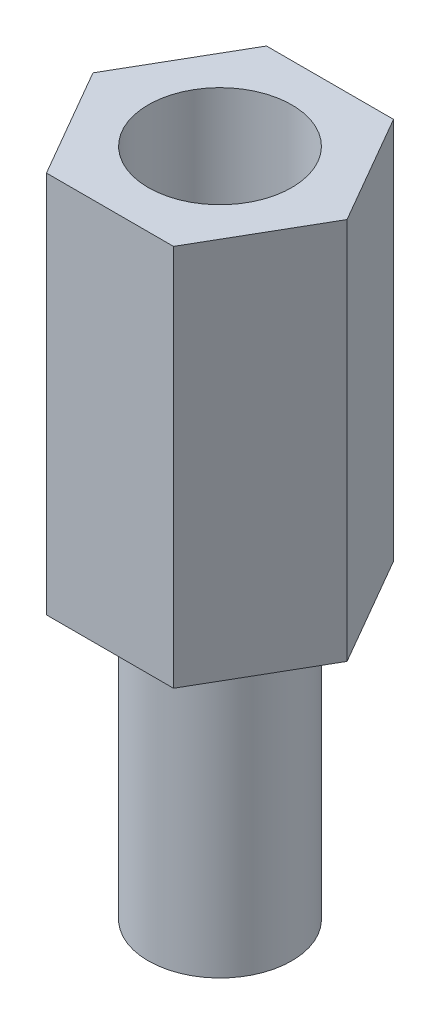
ISO-10303-21;
HEADER;
FILE_DESCRIPTION(('STEP AP214'),'2;1');
FILE_NAME('part.step','',(''),(''),'','','');
FILE_SCHEMA(('AUTOMOTIVE_DESIGN { 1 0 10303 214 1 1 1 1 }'));
ENDSEC;
DATA;
#1=APPLICATION_CONTEXT('core data for automotive mechanical design processes');
#2=APPLICATION_PROTOCOL_DEFINITION('international standard','automotive_design',2000,#1);
#3=PRODUCT_CONTEXT('',#1,'mechanical');
#4=PRODUCT('Part','Part','',(#3));
#5=PRODUCT_RELATED_PRODUCT_CATEGORY('part','',(#4));
#6=PRODUCT_DEFINITION_FORMATION('','',#4);
#7=PRODUCT_DEFINITION_CONTEXT('part definition',#1,'design');
#8=PRODUCT_DEFINITION('design','',#6,#7);
#9=PRODUCT_DEFINITION_SHAPE('','',#8);
#10=(LENGTH_UNIT() NAMED_UNIT(*) SI_UNIT(.MILLI.,.METRE.));
#11=(NAMED_UNIT(*) PLANE_ANGLE_UNIT() SI_UNIT($,.RADIAN.));
#12=(NAMED_UNIT(*) SI_UNIT($,.STERADIAN.) SOLID_ANGLE_UNIT());
#13=UNCERTAINTY_MEASURE_WITH_UNIT(LENGTH_MEASURE(1.E-05),#10,'distance_accuracy_value','');
#14=(GEOMETRIC_REPRESENTATION_CONTEXT(3) GLOBAL_UNCERTAINTY_ASSIGNED_CONTEXT((#13)) GLOBAL_UNIT_ASSIGNED_CONTEXT((#10,
#11,#12)) REPRESENTATION_CONTEXT('',''));
#15=CARTESIAN_POINT('',(0.,0.,0.));
#16=DIRECTION('',(0.,0.,1.));
#17=DIRECTION('',(1.,0.,0.));
#18=AXIS2_PLACEMENT_3D('',#15,#16,#17);
#19=CARTESIAN_POINT('',(1.32790561913616,8.,2.29999999999999));
#20=DIRECTION('',(-0.866025403784444,0.,-0.499999999999992));
#21=DIRECTION('',(-0.499999999999992,0.,0.866025403784444));
#22=AXIS2_PLACEMENT_3D('',#19,#20,#21);
#23=PLANE('',#22);
#24=DIRECTION('',(0.499999999999992,0.,-0.866025403784444));
#25=VECTOR('',#24,1.);
#26=CARTESIAN_POINT('',(1.32790561913616,0.,2.29999999999999));
#27=LINE('',#26,#25);
#28=CARTESIAN_POINT('',(1.32790561913616,0.,2.29999999999999));
#29=VERTEX_POINT('',#28);
#30=CARTESIAN_POINT('',(2.65581123827228,0.,0.));
#31=VERTEX_POINT('',#30);
#32=EDGE_CURVE('E128',#29,#31,#27,.T.);
#33=ORIENTED_EDGE('',*,*,#32,.T.);
#34=DIRECTION('',(0.,-1.,0.));
#35=VECTOR('',#34,1.);
#36=CARTESIAN_POINT('',(2.65581123827228,8.,0.));
#37=LINE('',#36,#35);
#38=CARTESIAN_POINT('',(2.65581123827228,8.,0.));
#39=VERTEX_POINT('',#38);
#40=EDGE_CURVE('E11',#39,#31,#37,.T.);
#41=ORIENTED_EDGE('',*,*,#40,.F.);
#42=DIRECTION('',(0.499999999999992,0.,-0.866025403784444));
#43=VECTOR('',#42,1.);
#44=CARTESIAN_POINT('',(1.32790561913616,8.,2.29999999999999));
#45=LINE('',#44,#43);
#46=CARTESIAN_POINT('',(1.32790561913616,8.,2.29999999999999));
#47=VERTEX_POINT('',#46);
#48=EDGE_CURVE('E145',#47,#39,#45,.T.);
#49=ORIENTED_EDGE('',*,*,#48,.F.);
#50=DIRECTION('',(0.,-1.,0.));
#51=VECTOR('',#50,1.);
#52=CARTESIAN_POINT('',(1.32790561913616,8.,2.29999999999999));
#53=LINE('',#52,#51);
#54=EDGE_CURVE('E124',#47,#29,#53,.T.);
#55=ORIENTED_EDGE('',*,*,#54,.T.);
#56=EDGE_LOOP('',(#33,#41,#49,#55));
#57=FACE_BOUND('',#56,.T.);
#58=ADVANCED_FACE('F39',(#57),#23,.F.);
#59=CARTESIAN_POINT('',(2.65581123827228,8.,0.));
#60=DIRECTION('',(-0.866025403784434,0.,0.500000000000008));
#61=DIRECTION('',(0.500000000000008,0.,0.866025403784434));
#62=AXIS2_PLACEMENT_3D('',#59,#60,#61);
#63=PLANE('',#62);
#64=DIRECTION('',(-0.500000000000008,0.,-0.866025403784434));
#65=VECTOR('',#64,1.);
#66=CARTESIAN_POINT('',(2.65581123827228,0.,0.));
#67=LINE('',#66,#65);
#68=CARTESIAN_POINT('',(1.32790561913612,0.,-2.30000000000001));
#69=VERTEX_POINT('',#68);
#70=EDGE_CURVE('E132',#31,#69,#67,.T.);
#71=ORIENTED_EDGE('',*,*,#70,.T.);
#72=DIRECTION('',(0.,-1.,0.));
#73=VECTOR('',#72,1.);
#74=CARTESIAN_POINT('',(1.32790561913612,8.,-2.30000000000001));
#75=LINE('',#74,#73);
#76=CARTESIAN_POINT('',(1.32790561913612,8.,-2.30000000000001));
#77=VERTEX_POINT('',#76);
#78=EDGE_CURVE('E48',#77,#69,#75,.T.);
#79=ORIENTED_EDGE('',*,*,#78,.F.);
#80=DIRECTION('',(-0.500000000000008,0.,-0.866025403784434));
#81=VECTOR('',#80,1.);
#82=CARTESIAN_POINT('',(2.65581123827228,8.,0.));
#83=LINE('',#82,#81);
#84=EDGE_CURVE('E93',#39,#77,#83,.T.);
#85=ORIENTED_EDGE('',*,*,#84,.F.);
#86=ORIENTED_EDGE('',*,*,#40,.T.);
#87=EDGE_LOOP('',(#71,#79,#85,#86));
#88=FACE_BOUND('',#87,.T.);
#89=ADVANCED_FACE('F174',(#88),#63,.F.);
#90=CARTESIAN_POINT('',(1.32790561913612,8.,-2.30000000000001));
#91=DIRECTION('',(0.,0.,1.));
#92=DIRECTION('',(1.,0.,0.));
#93=AXIS2_PLACEMENT_3D('',#90,#91,#92);
#94=PLANE('',#93);
#95=DIRECTION('',(-1.,0.,0.));
#96=VECTOR('',#95,1.);
#97=CARTESIAN_POINT('',(1.32790561913612,0.,-2.30000000000001));
#98=LINE('',#97,#96);
#99=CARTESIAN_POINT('',(-1.32790561913616,0.,-2.29999999999999));
#100=VERTEX_POINT('',#99);
#101=EDGE_CURVE('E136',#69,#100,#98,.T.);
#102=ORIENTED_EDGE('',*,*,#101,.T.);
#103=DIRECTION('',(0.,-1.,0.));
#104=VECTOR('',#103,1.);
#105=CARTESIAN_POINT('',(-1.32790561913616,8.,-2.29999999999999));
#106=LINE('',#105,#104);
#107=CARTESIAN_POINT('',(-1.32790561913616,8.,-2.29999999999999));
#108=VERTEX_POINT('',#107);
#109=EDGE_CURVE('E117',#108,#100,#106,.T.);
#110=ORIENTED_EDGE('',*,*,#109,.F.);
#111=DIRECTION('',(-1.,0.,0.));
#112=VECTOR('',#111,1.);
#113=CARTESIAN_POINT('',(1.32790561913612,8.,-2.30000000000001));
#114=LINE('',#113,#112);
#115=EDGE_CURVE('E106',#77,#108,#114,.T.);
#116=ORIENTED_EDGE('',*,*,#115,.F.);
#117=ORIENTED_EDGE('',*,*,#78,.T.);
#118=EDGE_LOOP('',(#102,#110,#116,#117));
#119=FACE_BOUND('',#118,.T.);
#120=ADVANCED_FACE('F155',(#119),#94,.F.);
#121=CARTESIAN_POINT('',(-1.32790561913616,8.,-2.29999999999999));
#122=DIRECTION('',(0.866025403784443,0.,0.499999999999992));
#123=DIRECTION('',(0.499999999999992,0.,-0.866025403784443));
#124=AXIS2_PLACEMENT_3D('',#121,#122,#123);
#125=PLANE('',#124);
#126=DIRECTION('',(-0.499999999999992,0.,0.866025403784443));
#127=VECTOR('',#126,1.);
#128=CARTESIAN_POINT('',(-1.32790561913616,0.,-2.29999999999999));
#129=LINE('',#128,#127);
#130=CARTESIAN_POINT('',(-2.65581123827228,0.,0.));
#131=VERTEX_POINT('',#130);
#132=EDGE_CURVE('E115',#100,#131,#129,.T.);
#133=ORIENTED_EDGE('',*,*,#132,.T.);
#134=DIRECTION('',(0.,-1.,0.));
#135=VECTOR('',#134,1.);
#136=CARTESIAN_POINT('',(-2.65581123827228,8.,0.));
#137=LINE('',#136,#135);
#138=CARTESIAN_POINT('',(-2.65581123827228,8.,0.));
#139=VERTEX_POINT('',#138);
#140=EDGE_CURVE('E112',#139,#131,#137,.T.);
#141=ORIENTED_EDGE('',*,*,#140,.F.);
#142=DIRECTION('',(-0.499999999999992,0.,0.866025403784443));
#143=VECTOR('',#142,1.);
#144=CARTESIAN_POINT('',(-1.32790561913616,8.,-2.29999999999999));
#145=LINE('',#144,#143);
#146=EDGE_CURVE('E100',#108,#139,#145,.T.);
#147=ORIENTED_EDGE('',*,*,#146,.F.);
#148=ORIENTED_EDGE('',*,*,#109,.T.);
#149=EDGE_LOOP('',(#133,#141,#147,#148));
#150=FACE_BOUND('',#149,.T.);
#151=ADVANCED_FACE('F113',(#150),#125,.F.);
#152=CARTESIAN_POINT('',(-2.65581123827228,8.,0.));
#153=DIRECTION('',(0.866025403784434,0.,-0.500000000000008));
#154=DIRECTION('',(-0.500000000000008,0.,-0.866025403784434));
#155=AXIS2_PLACEMENT_3D('',#152,#153,#154);
#156=PLANE('',#155);
#157=DIRECTION('',(0.500000000000008,0.,0.866025403784434));
#158=VECTOR('',#157,1.);
#159=CARTESIAN_POINT('',(-2.65581123827228,0.,0.));
#160=LINE('',#159,#158);
#161=CARTESIAN_POINT('',(-1.32790561913612,0.,2.30000000000001));
#162=VERTEX_POINT('',#161);
#163=EDGE_CURVE('E79',#131,#162,#160,.T.);
#164=ORIENTED_EDGE('',*,*,#163,.T.);
#165=DIRECTION('',(0.,-1.,0.));
#166=VECTOR('',#165,1.);
#167=CARTESIAN_POINT('',(-1.32790561913612,8.,2.30000000000001));
#168=LINE('',#167,#166);
#169=CARTESIAN_POINT('',(-1.32790561913612,8.,2.30000000000001));
#170=VERTEX_POINT('',#169);
#171=EDGE_CURVE('E118',#170,#162,#168,.T.);
#172=ORIENTED_EDGE('',*,*,#171,.F.);
#173=DIRECTION('',(0.500000000000008,0.,0.866025403784434));
#174=VECTOR('',#173,1.);
#175=CARTESIAN_POINT('',(-2.65581123827228,8.,0.));
#176=LINE('',#175,#174);
#177=EDGE_CURVE('E104',#139,#170,#176,.T.);
#178=ORIENTED_EDGE('',*,*,#177,.F.);
#179=ORIENTED_EDGE('',*,*,#140,.T.);
#180=EDGE_LOOP('',(#164,#172,#178,#179));
#181=FACE_BOUND('',#180,.T.);
#182=ADVANCED_FACE('F120',(#181),#156,.F.);
#183=CARTESIAN_POINT('',(-1.32790561913612,8.,2.30000000000001));
#184=DIRECTION('',(0.,0.,-1.));
#185=DIRECTION('',(-1.,0.,0.));
#186=AXIS2_PLACEMENT_3D('',#183,#184,#185);
#187=PLANE('',#186);
#188=DIRECTION('',(1.,0.,0.));
#189=VECTOR('',#188,1.);
#190=CARTESIAN_POINT('',(-1.32790561913612,0.,2.30000000000001));
#191=LINE('',#190,#189);
#192=EDGE_CURVE('E85',#162,#29,#191,.T.);
#193=ORIENTED_EDGE('',*,*,#192,.T.);
#194=ORIENTED_EDGE('',*,*,#54,.F.);
#195=DIRECTION('',(1.,0.,0.));
#196=VECTOR('',#195,1.);
#197=CARTESIAN_POINT('',(-1.32790561913612,8.,2.30000000000001));
#198=LINE('',#197,#196);
#199=EDGE_CURVE('E56',#170,#47,#198,.T.);
#200=ORIENTED_EDGE('',*,*,#199,.F.);
#201=ORIENTED_EDGE('',*,*,#171,.T.);
#202=EDGE_LOOP('',(#193,#194,#200,#201));
#203=FACE_BOUND('',#202,.T.);
#204=ADVANCED_FACE('F162',(#203),#187,.F.);
#205=CARTESIAN_POINT('',(0.,8.,0.));
#206=DIRECTION('',(0.,1.,0.));
#207=DIRECTION('',(0.,0.,1.));
#208=AXIS2_PLACEMENT_3D('',#205,#206,#207);
#209=PLANE('',#208);
#210=CARTESIAN_POINT('',(0.,8.,0.));
#211=DIRECTION('',(0.,1.,0.));
#212=DIRECTION('',(0.,0.,1.));
#213=AXIS2_PLACEMENT_3D('',#210,#211,#212);
#214=CIRCLE('',#213,1.5);
#215=CARTESIAN_POINT('',(0.,8.,1.5));
#216=VERTEX_POINT('',#215);
#217=EDGE_CURVE('E259',#216,#216,#214,.T.);
#218=ORIENTED_EDGE('',*,*,#217,.F.);
#219=EDGE_LOOP('',(#218));
#220=FACE_BOUND('',#219,.T.);
#221=ORIENTED_EDGE('',*,*,#48,.T.);
#222=ORIENTED_EDGE('',*,*,#84,.T.);
#223=ORIENTED_EDGE('',*,*,#115,.T.);
#224=ORIENTED_EDGE('',*,*,#146,.T.);
#225=ORIENTED_EDGE('',*,*,#177,.T.);
#226=ORIENTED_EDGE('',*,*,#199,.T.);
#227=EDGE_LOOP('',(#221,#222,#223,#224,#225,#226));
#228=FACE_BOUND('',#227,.T.);
#229=ADVANCED_FACE('F102',(#220,#228),#209,.T.);
#230=CARTESIAN_POINT('',(0.,0.,0.));
#231=DIRECTION('',(0.,1.,0.));
#232=DIRECTION('',(0.,0.,1.));
#233=AXIS2_PLACEMENT_3D('',#230,#231,#232);
#234=PLANE('',#233);
#235=CARTESIAN_POINT('',(0.,0.,0.));
#236=DIRECTION('',(0.,1.,0.));
#237=DIRECTION('',(0.,0.,1.));
#238=AXIS2_PLACEMENT_3D('',#235,#236,#237);
#239=CIRCLE('',#238,1.5);
#240=CARTESIAN_POINT('',(0.,0.,1.5));
#241=VERTEX_POINT('',#240);
#242=EDGE_CURVE('E258',#241,#241,#239,.T.);
#243=ORIENTED_EDGE('',*,*,#242,.T.);
#244=EDGE_LOOP('',(#243));
#245=FACE_BOUND('',#244,.T.);
#246=ORIENTED_EDGE('',*,*,#32,.F.);
#247=ORIENTED_EDGE('',*,*,#192,.F.);
#248=ORIENTED_EDGE('',*,*,#163,.F.);
#249=ORIENTED_EDGE('',*,*,#132,.F.);
#250=ORIENTED_EDGE('',*,*,#101,.F.);
#251=ORIENTED_EDGE('',*,*,#70,.F.);
#252=EDGE_LOOP('',(#246,#247,#248,#249,#250,#251));
#253=FACE_BOUND('',#252,.T.);
#254=ADVANCED_FACE('F158',(#245,#253),#234,.F.);
#255=CARTESIAN_POINT('',(0.,-6.,0.));
#256=DIRECTION('',(0.,1.,0.));
#257=DIRECTION('',(0.,0.,1.));
#258=AXIS2_PLACEMENT_3D('',#255,#256,#257);
#259=CYLINDRICAL_SURFACE('',#258,1.5);
#260=CARTESIAN_POINT('',(0.,-6.,0.));
#261=DIRECTION('',(0.,1.,0.));
#262=DIRECTION('',(0.,0.,1.));
#263=AXIS2_PLACEMENT_3D('',#260,#261,#262);
#264=CIRCLE('',#263,1.5);
#265=CARTESIAN_POINT('',(0.,-6.,1.5));
#266=VERTEX_POINT('',#265);
#267=EDGE_CURVE('E133',#266,#266,#264,.T.);
#268=ORIENTED_EDGE('',*,*,#267,.T.);
#269=EDGE_LOOP('',(#268));
#270=FACE_BOUND('',#269,.T.);
#271=ORIENTED_EDGE('',*,*,#242,.F.);
#272=EDGE_LOOP('',(#271));
#273=FACE_BOUND('',#272,.T.);
#274=ADVANCED_FACE('F206',(#270,#273),#259,.T.);
#275=CARTESIAN_POINT('',(0.,-6.,0.));
#276=DIRECTION('',(0.,1.,0.));
#277=DIRECTION('',(0.,0.,1.));
#278=AXIS2_PLACEMENT_3D('',#275,#276,#277);
#279=PLANE('',#278);
#280=ORIENTED_EDGE('',*,*,#267,.F.);
#281=EDGE_LOOP('',(#280));
#282=FACE_BOUND('',#281,.T.);
#283=ADVANCED_FACE('F215',(#282),#279,.F.);
#284=CARTESIAN_POINT('',(0.,2.,0.));
#285=DIRECTION('',(0.,1.,0.));
#286=DIRECTION('',(0.,0.,1.));
#287=AXIS2_PLACEMENT_3D('',#284,#285,#286);
#288=CYLINDRICAL_SURFACE('',#287,1.5);
#289=CARTESIAN_POINT('',(0.,2.,0.));
#290=DIRECTION('',(0.,1.,0.));
#291=DIRECTION('',(0.,0.,1.));
#292=AXIS2_PLACEMENT_3D('',#289,#290,#291);
#293=CIRCLE('',#292,1.5);
#294=CARTESIAN_POINT('',(0.,2.,1.5));
#295=VERTEX_POINT('',#294);
#296=EDGE_CURVE('E256',#295,#295,#293,.T.);
#297=ORIENTED_EDGE('',*,*,#296,.F.);
#298=EDGE_LOOP('',(#297));
#299=FACE_BOUND('',#298,.T.);
#300=ORIENTED_EDGE('',*,*,#217,.T.);
#301=EDGE_LOOP('',(#300));
#302=FACE_BOUND('',#301,.T.);
#303=ADVANCED_FACE('F225',(#299,#302),#288,.F.);
#304=CARTESIAN_POINT('',(0.,2.,0.));
#305=DIRECTION('',(0.,1.,0.));
#306=DIRECTION('',(0.,0.,1.));
#307=AXIS2_PLACEMENT_3D('',#304,#305,#306);
#308=PLANE('',#307);
#309=ORIENTED_EDGE('',*,*,#296,.T.);
#310=EDGE_LOOP('',(#309));
#311=FACE_BOUND('',#310,.T.);
#312=ADVANCED_FACE('F240',(#311),#308,.T.);
#313=CLOSED_SHELL('',(#58,#89,#120,#151,#182,#204,#229,#254,#274,#283,#303,#312));
#314=MANIFOLD_SOLID_BREP('B2',#313);
#315=ADVANCED_BREP_SHAPE_REPRESENTATION('',(#18,#314),#14);
#316=SHAPE_DEFINITION_REPRESENTATION(#9,#315);
ENDSEC;
END-ISO-10303-21;
